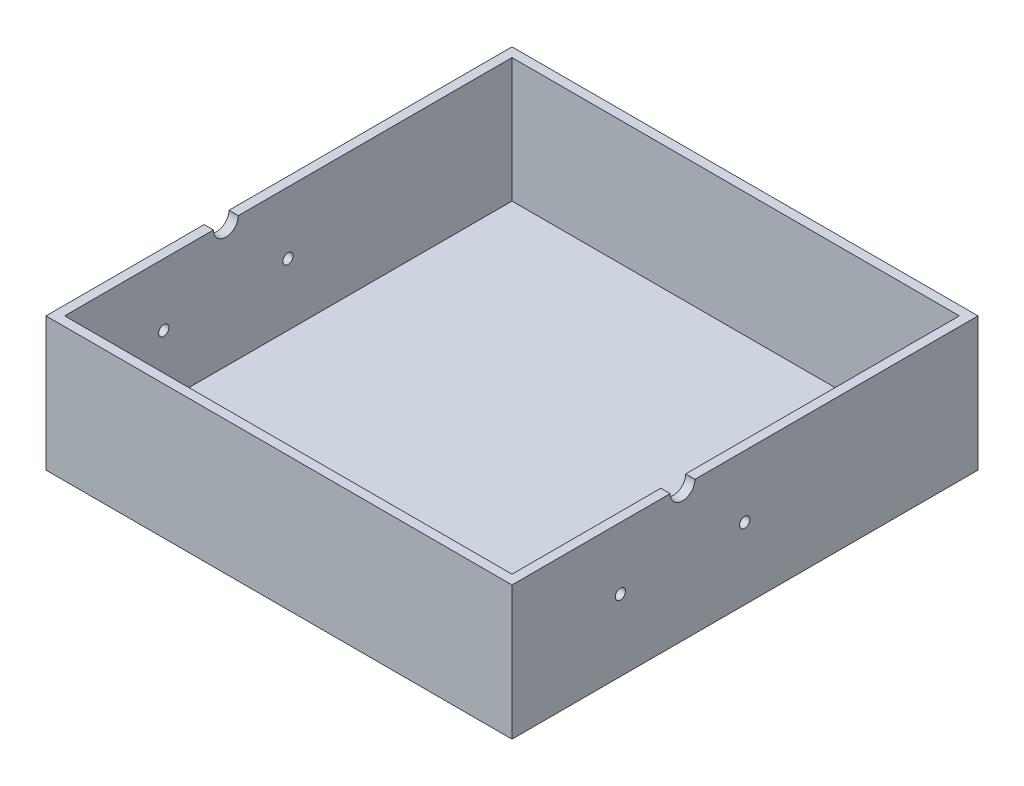
ISO-10303-21;
HEADER;
FILE_DESCRIPTION(('STEP AP214'),'2;1');
FILE_NAME('part.step','',(''),(''),'','','');
FILE_SCHEMA(('AUTOMOTIVE_DESIGN { 1 0 10303 214 1 1 1 1 }'));
ENDSEC;
DATA;
#1=APPLICATION_CONTEXT('core data for automotive mechanical design processes');
#2=APPLICATION_PROTOCOL_DEFINITION('international standard','automotive_design',2000,#1);
#3=PRODUCT_CONTEXT('',#1,'mechanical');
#4=PRODUCT('Part','Part','',(#3));
#5=PRODUCT_RELATED_PRODUCT_CATEGORY('part','',(#4));
#6=PRODUCT_DEFINITION_FORMATION('','',#4);
#7=PRODUCT_DEFINITION_CONTEXT('part definition',#1,'design');
#8=PRODUCT_DEFINITION('design','',#6,#7);
#9=PRODUCT_DEFINITION_SHAPE('','',#8);
#10=(LENGTH_UNIT() NAMED_UNIT(*) SI_UNIT(.MILLI.,.METRE.));
#11=(NAMED_UNIT(*) PLANE_ANGLE_UNIT() SI_UNIT($,.RADIAN.));
#12=(NAMED_UNIT(*) SI_UNIT($,.STERADIAN.) SOLID_ANGLE_UNIT());
#13=UNCERTAINTY_MEASURE_WITH_UNIT(LENGTH_MEASURE(1.E-05),#10,'distance_accuracy_value','');
#14=(GEOMETRIC_REPRESENTATION_CONTEXT(3) GLOBAL_UNCERTAINTY_ASSIGNED_CONTEXT((#13)) GLOBAL_UNIT_ASSIGNED_CONTEXT((#10,
#11,#12)) REPRESENTATION_CONTEXT('',''));
#15=CARTESIAN_POINT('',(0.,0.,0.));
#16=DIRECTION('',(0.,0.,1.));
#17=DIRECTION('',(1.,0.,0.));
#18=AXIS2_PLACEMENT_3D('',#15,#16,#17);
#19=CARTESIAN_POINT('',(0.,43.,0.));
#20=DIRECTION('',(0.,1.,0.));
#21=DIRECTION('',(0.,0.,1.));
#22=AXIS2_PLACEMENT_3D('',#19,#20,#21);
#23=PLANE('',#22);
#24=DIRECTION('',(1.,0.,0.));
#25=VECTOR('',#24,1.);
#26=CARTESIAN_POINT('',(-75.,43.,24.1));
#27=LINE('',#26,#25);
#28=CARTESIAN_POINT('',(-75.,43.,24.1));
#29=VERTEX_POINT('',#28);
#30=CARTESIAN_POINT('',(-72.,43.,24.1));
#31=VERTEX_POINT('',#30);
#32=EDGE_CURVE('E55',#29,#31,#27,.T.);
#33=ORIENTED_EDGE('',*,*,#32,.F.);
#34=DIRECTION('',(0.,0.,1.));
#35=VECTOR('',#34,1.);
#36=CARTESIAN_POINT('',(-75.,43.,75.));
#37=LINE('',#36,#35);
#38=CARTESIAN_POINT('',(-75.,43.,75.));
#39=VERTEX_POINT('',#38);
#40=EDGE_CURVE('E144',#29,#39,#37,.T.);
#41=ORIENTED_EDGE('',*,*,#40,.T.);
#42=DIRECTION('',(1.,0.,0.));
#43=VECTOR('',#42,1.);
#44=CARTESIAN_POINT('',(75.,43.,75.));
#45=LINE('',#44,#43);
#46=CARTESIAN_POINT('',(75.,43.,75.));
#47=VERTEX_POINT('',#46);
#48=EDGE_CURVE('E154',#39,#47,#45,.T.);
#49=ORIENTED_EDGE('',*,*,#48,.T.);
#50=DIRECTION('',(0.,0.,-1.));
#51=VECTOR('',#50,1.);
#52=CARTESIAN_POINT('',(75.,43.,75.));
#53=LINE('',#52,#51);
#54=CARTESIAN_POINT('',(75.,43.,24.1));
#55=VERTEX_POINT('',#54);
#56=EDGE_CURVE('E165',#47,#55,#53,.T.);
#57=ORIENTED_EDGE('',*,*,#56,.T.);
#58=CARTESIAN_POINT('',(72.,43.,24.1));
#59=VERTEX_POINT('',#58);
#60=EDGE_CURVE('E220',#59,#55,#27,.T.);
#61=ORIENTED_EDGE('',*,*,#60,.F.);
#62=DIRECTION('',(0.,0.,-1.));
#63=VECTOR('',#62,1.);
#64=CARTESIAN_POINT('',(72.,43.,72.));
#65=LINE('',#64,#63);
#66=CARTESIAN_POINT('',(72.,43.,72.));
#67=VERTEX_POINT('',#66);
#68=EDGE_CURVE('E233',#67,#59,#65,.T.);
#69=ORIENTED_EDGE('',*,*,#68,.F.);
#70=DIRECTION('',(1.,0.,0.));
#71=VECTOR('',#70,1.);
#72=CARTESIAN_POINT('',(72.,43.,72.));
#73=LINE('',#72,#71);
#74=CARTESIAN_POINT('',(-72.,43.,72.));
#75=VERTEX_POINT('',#74);
#76=EDGE_CURVE('E228',#75,#67,#73,.T.);
#77=ORIENTED_EDGE('',*,*,#76,.F.);
#78=DIRECTION('',(0.,0.,1.));
#79=VECTOR('',#78,1.);
#80=CARTESIAN_POINT('',(-72.,43.,72.));
#81=LINE('',#80,#79);
#82=EDGE_CURVE('E229',#31,#75,#81,.T.);
#83=ORIENTED_EDGE('',*,*,#82,.F.);
#84=EDGE_LOOP('',(#33,#41,#49,#57,#61,#69,#77,#83));
#85=FACE_BOUND('',#84,.T.);
#86=ADVANCED_FACE('F39',(#85),#23,.T.);
#87=CARTESIAN_POINT('',(75.,3.,75.));
#88=DIRECTION('',(-1.,0.,0.));
#89=DIRECTION('',(0.,0.,1.));
#90=AXIS2_PLACEMENT_3D('',#87,#88,#89);
#91=PLANE('',#90);
#92=CARTESIAN_POINT('',(75.,23.,0.0999999999999959));
#93=DIRECTION('',(1.,0.,0.));
#94=DIRECTION('',(0.,0.,-1.));
#95=AXIS2_PLACEMENT_3D('',#92,#93,#94);
#96=CIRCLE('',#95,1.65);
#97=CARTESIAN_POINT('',(75.,23.,-1.55));
#98=VERTEX_POINT('',#97);
#99=EDGE_CURVE('E306',#98,#98,#96,.T.);
#100=ORIENTED_EDGE('',*,*,#99,.F.);
#101=EDGE_LOOP('',(#100));
#102=FACE_BOUND('',#101,.T.);
#103=CARTESIAN_POINT('',(75.,23.,40.1));
#104=DIRECTION('',(1.,0.,0.));
#105=DIRECTION('',(0.,0.,-1.));
#106=AXIS2_PLACEMENT_3D('',#103,#104,#105);
#107=CIRCLE('',#106,1.65);
#108=CARTESIAN_POINT('',(75.,23.,38.45));
#109=VERTEX_POINT('',#108);
#110=EDGE_CURVE('E216',#109,#109,#107,.T.);
#111=ORIENTED_EDGE('',*,*,#110,.F.);
#112=EDGE_LOOP('',(#111));
#113=FACE_BOUND('',#112,.T.);
#114=CARTESIAN_POINT('',(75.,43.,16.1));
#115=VERTEX_POINT('',#114);
#116=CARTESIAN_POINT('',(75.,43.,-75.));
#117=VERTEX_POINT('',#116);
#118=EDGE_CURVE('E159',#115,#117,#53,.T.);
#119=ORIENTED_EDGE('',*,*,#118,.F.);
#120=CARTESIAN_POINT('',(75.,43.,20.1));
#121=DIRECTION('',(1.,0.,0.));
#122=DIRECTION('',(0.,0.,-1.));
#123=AXIS2_PLACEMENT_3D('',#120,#121,#122);
#124=CIRCLE('',#123,4.);
#125=EDGE_CURVE('E147',#55,#115,#124,.T.);
#126=ORIENTED_EDGE('',*,*,#125,.F.);
#127=ORIENTED_EDGE('',*,*,#56,.F.);
#128=DIRECTION('',(0.,-1.,0.));
#129=VECTOR('',#128,1.);
#130=CARTESIAN_POINT('',(75.,3.,75.));
#131=LINE('',#130,#129);
#132=CARTESIAN_POINT('',(75.,0.,75.));
#133=VERTEX_POINT('',#132);
#134=EDGE_CURVE('E184',#47,#133,#131,.T.);
#135=ORIENTED_EDGE('',*,*,#134,.T.);
#136=DIRECTION('',(0.,0.,-1.));
#137=VECTOR('',#136,1.);
#138=CARTESIAN_POINT('',(75.,0.,75.));
#139=LINE('',#138,#137);
#140=CARTESIAN_POINT('',(75.,0.,-75.));
#141=VERTEX_POINT('',#140);
#142=EDGE_CURVE('E171',#133,#141,#139,.T.);
#143=ORIENTED_EDGE('',*,*,#142,.T.);
#144=DIRECTION('',(0.,-1.,0.));
#145=VECTOR('',#144,1.);
#146=CARTESIAN_POINT('',(75.,3.,-75.));
#147=LINE('',#146,#145);
#148=EDGE_CURVE('E48',#117,#141,#147,.T.);
#149=ORIENTED_EDGE('',*,*,#148,.F.);
#150=EDGE_LOOP('',(#119,#126,#127,#135,#143,#149));
#151=FACE_BOUND('',#150,.T.);
#152=ADVANCED_FACE('F41',(#102,#113,#151),#91,.F.);
#153=CARTESIAN_POINT('',(-75.,3.,-75.));
#154=DIRECTION('',(0.,0.,1.));
#155=DIRECTION('',(1.,0.,0.));
#156=AXIS2_PLACEMENT_3D('',#153,#154,#155);
#157=PLANE('',#156);
#158=DIRECTION('',(-1.,0.,0.));
#159=VECTOR('',#158,1.);
#160=CARTESIAN_POINT('',(-75.,0.,-75.));
#161=LINE('',#160,#159);
#162=CARTESIAN_POINT('',(-75.,0.,-75.));
#163=VERTEX_POINT('',#162);
#164=EDGE_CURVE('E175',#141,#163,#161,.T.);
#165=ORIENTED_EDGE('',*,*,#164,.T.);
#166=DIRECTION('',(0.,-1.,0.));
#167=VECTOR('',#166,1.);
#168=CARTESIAN_POINT('',(-75.,3.,-75.));
#169=LINE('',#168,#167);
#170=CARTESIAN_POINT('',(-75.,43.,-75.));
#171=VERTEX_POINT('',#170);
#172=EDGE_CURVE('E192',#171,#163,#169,.T.);
#173=ORIENTED_EDGE('',*,*,#172,.F.);
#174=DIRECTION('',(-1.,0.,0.));
#175=VECTOR('',#174,1.);
#176=CARTESIAN_POINT('',(75.,43.,-75.));
#177=LINE('',#176,#175);
#178=EDGE_CURVE('E152',#117,#171,#177,.T.);
#179=ORIENTED_EDGE('',*,*,#178,.F.);
#180=ORIENTED_EDGE('',*,*,#148,.T.);
#181=EDGE_LOOP('',(#165,#173,#179,#180));
#182=FACE_BOUND('',#181,.T.);
#183=ADVANCED_FACE('F323',(#182),#157,.F.);
#184=CARTESIAN_POINT('',(-75.,3.,75.));
#185=DIRECTION('',(1.,0.,0.));
#186=DIRECTION('',(0.,0.,-1.));
#187=AXIS2_PLACEMENT_3D('',#184,#185,#186);
#188=PLANE('',#187);
#189=CARTESIAN_POINT('',(-75.,23.,0.0999999999999959));
#190=DIRECTION('',(1.,0.,0.));
#191=DIRECTION('',(0.,0.,-1.));
#192=AXIS2_PLACEMENT_3D('',#189,#190,#191);
#193=CIRCLE('',#192,1.65);
#194=CARTESIAN_POINT('',(-75.,23.,-1.55));
#195=VERTEX_POINT('',#194);
#196=EDGE_CURVE('E302',#195,#195,#193,.T.);
#197=ORIENTED_EDGE('',*,*,#196,.T.);
#198=EDGE_LOOP('',(#197));
#199=FACE_BOUND('',#198,.T.);
#200=CARTESIAN_POINT('',(-75.,23.,40.1));
#201=DIRECTION('',(1.,0.,0.));
#202=DIRECTION('',(0.,0.,-1.));
#203=AXIS2_PLACEMENT_3D('',#200,#201,#202);
#204=CIRCLE('',#203,1.65);
#205=CARTESIAN_POINT('',(-75.,23.,38.45));
#206=VERTEX_POINT('',#205);
#207=EDGE_CURVE('E311',#206,#206,#204,.T.);
#208=ORIENTED_EDGE('',*,*,#207,.T.);
#209=EDGE_LOOP('',(#208));
#210=FACE_BOUND('',#209,.T.);
#211=ORIENTED_EDGE('',*,*,#40,.F.);
#212=CARTESIAN_POINT('',(-75.,43.,20.1));
#213=DIRECTION('',(1.,0.,0.));
#214=DIRECTION('',(0.,0.,-1.));
#215=AXIS2_PLACEMENT_3D('',#212,#213,#214);
#216=CIRCLE('',#215,4.);
#217=CARTESIAN_POINT('',(-75.,43.,16.1));
#218=VERTEX_POINT('',#217);
#219=EDGE_CURVE('E129',#29,#218,#216,.T.);
#220=ORIENTED_EDGE('',*,*,#219,.T.);
#221=EDGE_CURVE('E142',#171,#218,#37,.T.);
#222=ORIENTED_EDGE('',*,*,#221,.F.);
#223=ORIENTED_EDGE('',*,*,#172,.T.);
#224=DIRECTION('',(0.,0.,1.));
#225=VECTOR('',#224,1.);
#226=CARTESIAN_POINT('',(-75.,0.,75.));
#227=LINE('',#226,#225);
#228=CARTESIAN_POINT('',(-75.,0.,75.));
#229=VERTEX_POINT('',#228);
#230=EDGE_CURVE('E178',#163,#229,#227,.T.);
#231=ORIENTED_EDGE('',*,*,#230,.T.);
#232=DIRECTION('',(0.,-1.,0.));
#233=VECTOR('',#232,1.);
#234=CARTESIAN_POINT('',(-75.,3.,75.));
#235=LINE('',#234,#233);
#236=EDGE_CURVE('E188',#39,#229,#235,.T.);
#237=ORIENTED_EDGE('',*,*,#236,.F.);
#238=EDGE_LOOP('',(#211,#220,#222,#223,#231,#237));
#239=FACE_BOUND('',#238,.T.);
#240=ADVANCED_FACE('F140',(#199,#210,#239),#188,.F.);
#241=CARTESIAN_POINT('',(-75.,3.,75.));
#242=DIRECTION('',(0.,0.,-1.));
#243=DIRECTION('',(-1.,0.,0.));
#244=AXIS2_PLACEMENT_3D('',#241,#242,#243);
#245=PLANE('',#244);
#246=DIRECTION('',(1.,0.,0.));
#247=VECTOR('',#246,1.);
#248=CARTESIAN_POINT('',(-75.,0.,75.));
#249=LINE('',#248,#247);
#250=EDGE_CURVE('E181',#229,#133,#249,.T.);
#251=ORIENTED_EDGE('',*,*,#250,.T.);
#252=ORIENTED_EDGE('',*,*,#134,.F.);
#253=ORIENTED_EDGE('',*,*,#48,.F.);
#254=ORIENTED_EDGE('',*,*,#236,.T.);
#255=EDGE_LOOP('',(#251,#252,#253,#254));
#256=FACE_BOUND('',#255,.T.);
#257=ADVANCED_FACE('F356',(#256),#245,.F.);
#258=CARTESIAN_POINT('',(0.,0.,0.));
#259=DIRECTION('',(0.,-1.,0.));
#260=DIRECTION('',(0.,0.,-1.));
#261=AXIS2_PLACEMENT_3D('',#258,#259,#260);
#262=PLANE('',#261);
#263=ORIENTED_EDGE('',*,*,#142,.F.);
#264=ORIENTED_EDGE('',*,*,#250,.F.);
#265=ORIENTED_EDGE('',*,*,#230,.F.);
#266=ORIENTED_EDGE('',*,*,#164,.F.);
#267=EDGE_LOOP('',(#263,#264,#265,#266));
#268=FACE_BOUND('',#267,.T.);
#269=ADVANCED_FACE('F361',(#268),#262,.T.);
#270=DIRECTION('',(1.,0.,0.));
#271=VECTOR('',#270,1.);
#272=CARTESIAN_POINT('',(-75.,43.,16.1));
#273=LINE('',#272,#271);
#274=CARTESIAN_POINT('',(72.,43.,16.1));
#275=VERTEX_POINT('',#274);
#276=EDGE_CURVE('E62',#115,#275,#273,.F.);
#277=ORIENTED_EDGE('',*,*,#276,.F.);
#278=ORIENTED_EDGE('',*,*,#118,.T.);
#279=ORIENTED_EDGE('',*,*,#178,.T.);
#280=ORIENTED_EDGE('',*,*,#221,.T.);
#281=CARTESIAN_POINT('',(-72.,43.,16.1));
#282=VERTEX_POINT('',#281);
#283=EDGE_CURVE('E126',#282,#218,#273,.F.);
#284=ORIENTED_EDGE('',*,*,#283,.F.);
#285=CARTESIAN_POINT('',(-72.,43.,-72.));
#286=VERTEX_POINT('',#285);
#287=EDGE_CURVE('E225',#286,#282,#81,.T.);
#288=ORIENTED_EDGE('',*,*,#287,.F.);
#289=DIRECTION('',(-1.,0.,0.));
#290=VECTOR('',#289,1.);
#291=CARTESIAN_POINT('',(72.,43.,-72.));
#292=LINE('',#291,#290);
#293=CARTESIAN_POINT('',(72.,43.,-72.));
#294=VERTEX_POINT('',#293);
#295=EDGE_CURVE('E237',#294,#286,#292,.T.);
#296=ORIENTED_EDGE('',*,*,#295,.F.);
#297=EDGE_CURVE('E232',#275,#294,#65,.T.);
#298=ORIENTED_EDGE('',*,*,#297,.F.);
#299=EDGE_LOOP('',(#277,#278,#279,#280,#284,#288,#296,#298));
#300=FACE_BOUND('',#299,.T.);
#301=ADVANCED_FACE('F150',(#300),#23,.T.);
#302=CARTESIAN_POINT('',(-72.,43.,72.));
#303=DIRECTION('',(1.,0.,0.));
#304=DIRECTION('',(0.,0.,-1.));
#305=AXIS2_PLACEMENT_3D('',#302,#303,#304);
#306=PLANE('',#305);
#307=CARTESIAN_POINT('',(-72.,43.,20.1));
#308=DIRECTION('',(1.,0.,0.));
#309=DIRECTION('',(0.,0.,-1.));
#310=AXIS2_PLACEMENT_3D('',#307,#308,#309);
#311=CIRCLE('',#310,4.);
#312=EDGE_CURVE('E130',#31,#282,#311,.T.);
#313=ORIENTED_EDGE('',*,*,#312,.F.);
#314=ORIENTED_EDGE('',*,*,#82,.T.);
#315=DIRECTION('',(0.,-1.,0.));
#316=VECTOR('',#315,1.);
#317=CARTESIAN_POINT('',(-72.,43.,72.));
#318=LINE('',#317,#316);
#319=CARTESIAN_POINT('',(-72.,3.,72.));
#320=VERTEX_POINT('',#319);
#321=EDGE_CURVE('E161',#75,#320,#318,.T.);
#322=ORIENTED_EDGE('',*,*,#321,.T.);
#323=DIRECTION('',(0.,0.,1.));
#324=VECTOR('',#323,1.);
#325=CARTESIAN_POINT('',(-72.,3.,72.));
#326=LINE('',#325,#324);
#327=CARTESIAN_POINT('',(-72.,3.,-72.));
#328=VERTEX_POINT('',#327);
#329=EDGE_CURVE('E241',#328,#320,#326,.T.);
#330=ORIENTED_EDGE('',*,*,#329,.F.);
#331=DIRECTION('',(0.,-1.,0.));
#332=VECTOR('',#331,1.);
#333=CARTESIAN_POINT('',(-72.,43.,-72.));
#334=LINE('',#333,#332);
#335=EDGE_CURVE('E240',#286,#328,#334,.T.);
#336=ORIENTED_EDGE('',*,*,#335,.F.);
#337=ORIENTED_EDGE('',*,*,#287,.T.);
#338=EDGE_LOOP('',(#313,#314,#322,#330,#336,#337));
#339=FACE_BOUND('',#338,.T.);
#340=CARTESIAN_POINT('',(-72.,23.,0.0999999999999959));
#341=DIRECTION('',(1.,0.,0.));
#342=DIRECTION('',(0.,0.,-1.));
#343=AXIS2_PLACEMENT_3D('',#340,#341,#342);
#344=CIRCLE('',#343,1.65);
#345=CARTESIAN_POINT('',(-72.,23.,-1.55));
#346=VERTEX_POINT('',#345);
#347=EDGE_CURVE('E204',#346,#346,#344,.T.);
#348=ORIENTED_EDGE('',*,*,#347,.F.);
#349=EDGE_LOOP('',(#348));
#350=FACE_BOUND('',#349,.T.);
#351=CARTESIAN_POINT('',(-72.,23.,40.1));
#352=DIRECTION('',(1.,0.,0.));
#353=DIRECTION('',(0.,0.,-1.));
#354=AXIS2_PLACEMENT_3D('',#351,#352,#353);
#355=CIRCLE('',#354,1.65);
#356=CARTESIAN_POINT('',(-72.,23.,38.45));
#357=VERTEX_POINT('',#356);
#358=EDGE_CURVE('E200',#357,#357,#355,.T.);
#359=ORIENTED_EDGE('',*,*,#358,.F.);
#360=EDGE_LOOP('',(#359));
#361=FACE_BOUND('',#360,.T.);
#362=ADVANCED_FACE('F271',(#339,#350,#361),#306,.T.);
#363=CARTESIAN_POINT('',(72.,43.,72.));
#364=DIRECTION('',(0.,0.,-1.));
#365=DIRECTION('',(-1.,0.,0.));
#366=AXIS2_PLACEMENT_3D('',#363,#364,#365);
#367=PLANE('',#366);
#368=DIRECTION('',(1.,0.,0.));
#369=VECTOR('',#368,1.);
#370=CARTESIAN_POINT('',(72.,3.,72.));
#371=LINE('',#370,#369);
#372=CARTESIAN_POINT('',(72.,3.,72.));
#373=VERTEX_POINT('',#372);
#374=EDGE_CURVE('E245',#320,#373,#371,.T.);
#375=ORIENTED_EDGE('',*,*,#374,.F.);
#376=ORIENTED_EDGE('',*,*,#321,.F.);
#377=ORIENTED_EDGE('',*,*,#76,.T.);
#378=DIRECTION('',(0.,-1.,0.));
#379=VECTOR('',#378,1.);
#380=CARTESIAN_POINT('',(72.,43.,72.));
#381=LINE('',#380,#379);
#382=EDGE_CURVE('E261',#67,#373,#381,.T.);
#383=ORIENTED_EDGE('',*,*,#382,.T.);
#384=EDGE_LOOP('',(#375,#376,#377,#383));
#385=FACE_BOUND('',#384,.T.);
#386=ADVANCED_FACE('F373',(#385),#367,.T.);
#387=CARTESIAN_POINT('',(72.,43.,72.));
#388=DIRECTION('',(-1.,0.,0.));
#389=DIRECTION('',(0.,0.,1.));
#390=AXIS2_PLACEMENT_3D('',#387,#388,#389);
#391=PLANE('',#390);
#392=CARTESIAN_POINT('',(72.,43.,20.1));
#393=DIRECTION('',(-1.,0.,0.));
#394=DIRECTION('',(0.,0.,1.));
#395=AXIS2_PLACEMENT_3D('',#392,#393,#394);
#396=CIRCLE('',#395,4.);
#397=EDGE_CURVE('E11',#275,#59,#396,.T.);
#398=ORIENTED_EDGE('',*,*,#397,.F.);
#399=ORIENTED_EDGE('',*,*,#297,.T.);
#400=DIRECTION('',(0.,-1.,0.));
#401=VECTOR('',#400,1.);
#402=CARTESIAN_POINT('',(72.,43.,-72.));
#403=LINE('',#402,#401);
#404=CARTESIAN_POINT('',(72.,3.,-72.));
#405=VERTEX_POINT('',#404);
#406=EDGE_CURVE('E259',#294,#405,#403,.T.);
#407=ORIENTED_EDGE('',*,*,#406,.T.);
#408=DIRECTION('',(0.,0.,-1.));
#409=VECTOR('',#408,1.);
#410=CARTESIAN_POINT('',(72.,3.,72.));
#411=LINE('',#410,#409);
#412=EDGE_CURVE('E249',#373,#405,#411,.T.);
#413=ORIENTED_EDGE('',*,*,#412,.F.);
#414=ORIENTED_EDGE('',*,*,#382,.F.);
#415=ORIENTED_EDGE('',*,*,#68,.T.);
#416=EDGE_LOOP('',(#398,#399,#407,#413,#414,#415));
#417=FACE_BOUND('',#416,.T.);
#418=CARTESIAN_POINT('',(72.,23.,0.0999999999999959));
#419=DIRECTION('',(-1.,0.,0.));
#420=DIRECTION('',(0.,0.,1.));
#421=AXIS2_PLACEMENT_3D('',#418,#419,#420);
#422=CIRCLE('',#421,1.65);
#423=CARTESIAN_POINT('',(72.,23.,1.75));
#424=VERTEX_POINT('',#423);
#425=EDGE_CURVE('E201',#424,#424,#422,.T.);
#426=ORIENTED_EDGE('',*,*,#425,.F.);
#427=EDGE_LOOP('',(#426));
#428=FACE_BOUND('',#427,.T.);
#429=CARTESIAN_POINT('',(72.,23.,40.1));
#430=DIRECTION('',(-1.,0.,0.));
#431=DIRECTION('',(0.,0.,1.));
#432=AXIS2_PLACEMENT_3D('',#429,#430,#431);
#433=CIRCLE('',#432,1.65);
#434=CARTESIAN_POINT('',(72.,23.,41.75));
#435=VERTEX_POINT('',#434);
#436=EDGE_CURVE('E146',#435,#435,#433,.T.);
#437=ORIENTED_EDGE('',*,*,#436,.F.);
#438=EDGE_LOOP('',(#437));
#439=FACE_BOUND('',#438,.T.);
#440=ADVANCED_FACE('F289',(#417,#428,#439),#391,.T.);
#441=CARTESIAN_POINT('',(72.,43.,-72.));
#442=DIRECTION('',(0.,0.,1.));
#443=DIRECTION('',(1.,0.,0.));
#444=AXIS2_PLACEMENT_3D('',#441,#442,#443);
#445=PLANE('',#444);
#446=DIRECTION('',(-1.,0.,0.));
#447=VECTOR('',#446,1.);
#448=CARTESIAN_POINT('',(72.,3.,-72.));
#449=LINE('',#448,#447);
#450=EDGE_CURVE('E253',#405,#328,#449,.T.);
#451=ORIENTED_EDGE('',*,*,#450,.F.);
#452=ORIENTED_EDGE('',*,*,#406,.F.);
#453=ORIENTED_EDGE('',*,*,#295,.T.);
#454=ORIENTED_EDGE('',*,*,#335,.T.);
#455=EDGE_LOOP('',(#451,#452,#453,#454));
#456=FACE_BOUND('',#455,.T.);
#457=ADVANCED_FACE('F281',(#456),#445,.T.);
#458=CARTESIAN_POINT('',(0.,3.,0.));
#459=DIRECTION('',(0.,-1.,0.));
#460=DIRECTION('',(0.,0.,-1.));
#461=AXIS2_PLACEMENT_3D('',#458,#459,#460);
#462=PLANE('',#461);
#463=ORIENTED_EDGE('',*,*,#450,.T.);
#464=ORIENTED_EDGE('',*,*,#329,.T.);
#465=ORIENTED_EDGE('',*,*,#374,.T.);
#466=ORIENTED_EDGE('',*,*,#412,.T.);
#467=EDGE_LOOP('',(#463,#464,#465,#466));
#468=FACE_BOUND('',#467,.T.);
#469=ADVANCED_FACE('F277',(#468),#462,.F.);
#470=CARTESIAN_POINT('',(-75.,23.,40.1));
#471=DIRECTION('',(1.,0.,0.));
#472=DIRECTION('',(0.,0.,-1.));
#473=AXIS2_PLACEMENT_3D('',#470,#471,#472);
#474=CYLINDRICAL_SURFACE('',#473,1.65);
#475=ORIENTED_EDGE('',*,*,#436,.T.);
#476=EDGE_LOOP('',(#475));
#477=FACE_BOUND('',#476,.T.);
#478=ORIENTED_EDGE('',*,*,#110,.T.);
#479=EDGE_LOOP('',(#478));
#480=FACE_BOUND('',#479,.T.);
#481=ADVANCED_FACE('F320',(#477,#480),#474,.F.);
#482=CARTESIAN_POINT('',(-75.,23.,0.0999999999999959));
#483=DIRECTION('',(1.,0.,0.));
#484=DIRECTION('',(0.,0.,-1.));
#485=AXIS2_PLACEMENT_3D('',#482,#483,#484);
#486=CYLINDRICAL_SURFACE('',#485,1.65);
#487=ORIENTED_EDGE('',*,*,#425,.T.);
#488=EDGE_LOOP('',(#487));
#489=FACE_BOUND('',#488,.T.);
#490=ORIENTED_EDGE('',*,*,#99,.T.);
#491=EDGE_LOOP('',(#490));
#492=FACE_BOUND('',#491,.T.);
#493=ADVANCED_FACE('F333',(#489,#492),#486,.F.);
#494=CARTESIAN_POINT('',(-75.,43.,20.1));
#495=DIRECTION('',(1.,0.,0.));
#496=DIRECTION('',(0.,0.,-1.));
#497=AXIS2_PLACEMENT_3D('',#494,#495,#496);
#498=CYLINDRICAL_SURFACE('',#497,4.);
#499=ORIENTED_EDGE('',*,*,#60,.T.);
#500=ORIENTED_EDGE('',*,*,#125,.T.);
#501=ORIENTED_EDGE('',*,*,#276,.T.);
#502=ORIENTED_EDGE('',*,*,#397,.T.);
#503=EDGE_LOOP('',(#499,#500,#501,#502));
#504=FACE_BOUND('',#503,.T.);
#505=ADVANCED_FACE('F293',(#504),#498,.F.);
#506=ORIENTED_EDGE('',*,*,#358,.T.);
#507=EDGE_LOOP('',(#506));
#508=FACE_BOUND('',#507,.T.);
#509=ORIENTED_EDGE('',*,*,#207,.F.);
#510=EDGE_LOOP('',(#509));
#511=FACE_BOUND('',#510,.T.);
#512=ADVANCED_FACE('F341',(#508,#511),#474,.F.);
#513=ORIENTED_EDGE('',*,*,#347,.T.);
#514=EDGE_LOOP('',(#513));
#515=FACE_BOUND('',#514,.T.);
#516=ORIENTED_EDGE('',*,*,#196,.F.);
#517=EDGE_LOOP('',(#516));
#518=FACE_BOUND('',#517,.T.);
#519=ADVANCED_FACE('F336',(#515,#518),#486,.F.);
#520=ORIENTED_EDGE('',*,*,#32,.T.);
#521=ORIENTED_EDGE('',*,*,#312,.T.);
#522=ORIENTED_EDGE('',*,*,#283,.T.);
#523=ORIENTED_EDGE('',*,*,#219,.F.);
#524=EDGE_LOOP('',(#520,#521,#522,#523));
#525=FACE_BOUND('',#524,.T.);
#526=ADVANCED_FACE('F128',(#525),#498,.F.);
#527=CLOSED_SHELL('',(#86,#152,#183,#240,#257,#269,#301,#362,#386,#440,#457,#469,#481,#493,#505,
#512,#519,#526));
#528=MANIFOLD_SOLID_BREP('B2',#527);
#529=ADVANCED_BREP_SHAPE_REPRESENTATION('',(#18,#528),#14);
#530=SHAPE_DEFINITION_REPRESENTATION(#9,#529);
ENDSEC;
END-ISO-10303-21;
